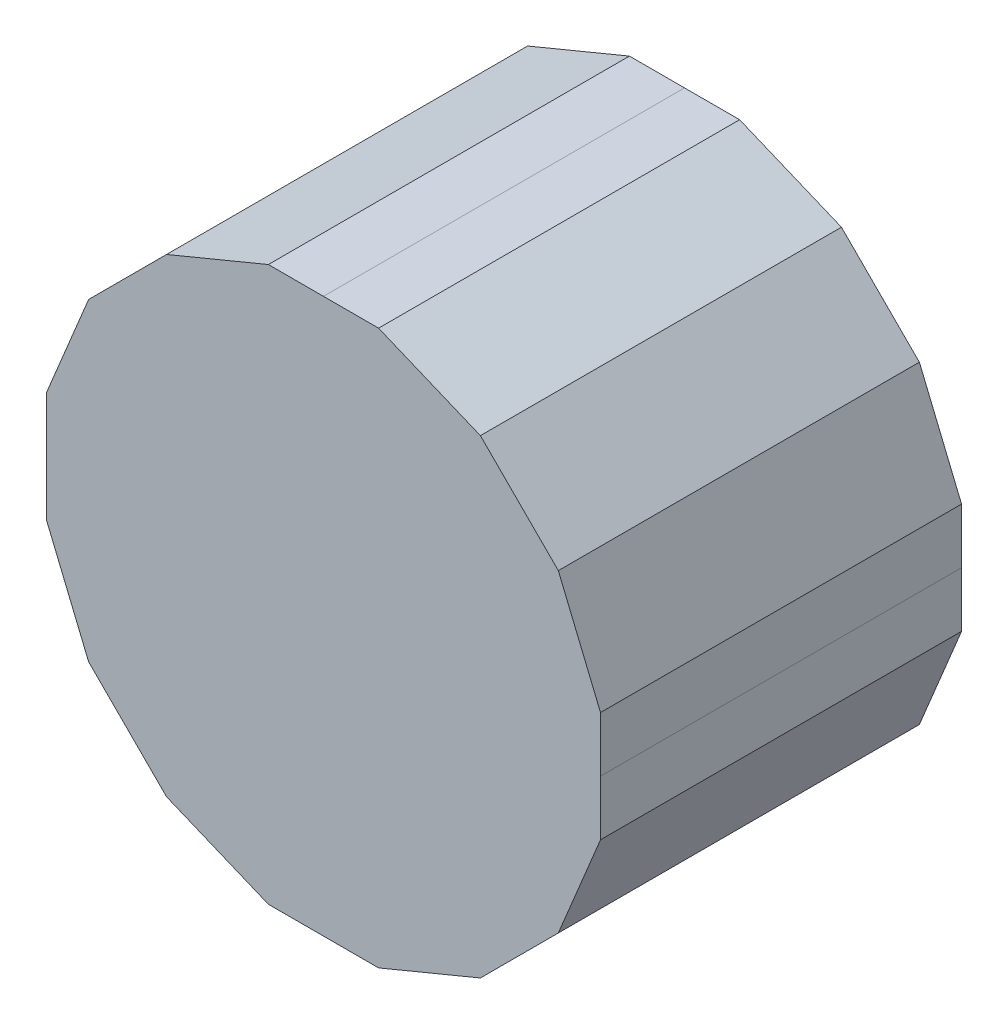
ISO-10303-21;
HEADER;
FILE_DESCRIPTION(('STEP AP214'),'2;1');
FILE_NAME('part.step','',(''),(''),'','','');
FILE_SCHEMA(('AUTOMOTIVE_DESIGN { 1 0 10303 214 1 1 1 1 }'));
ENDSEC;
DATA;
#1=APPLICATION_CONTEXT('core data for automotive mechanical design processes');
#2=APPLICATION_PROTOCOL_DEFINITION('international standard','automotive_design',2000,#1);
#3=PRODUCT_CONTEXT('',#1,'mechanical');
#4=PRODUCT('Part','Part','',(#3));
#5=PRODUCT_RELATED_PRODUCT_CATEGORY('part','',(#4));
#6=PRODUCT_DEFINITION_FORMATION('','',#4);
#7=PRODUCT_DEFINITION_CONTEXT('part definition',#1,'design');
#8=PRODUCT_DEFINITION('design','',#6,#7);
#9=PRODUCT_DEFINITION_SHAPE('','',#8);
#10=(LENGTH_UNIT() NAMED_UNIT(*) SI_UNIT(.MILLI.,.METRE.));
#11=(NAMED_UNIT(*) PLANE_ANGLE_UNIT() SI_UNIT($,.RADIAN.));
#12=(NAMED_UNIT(*) SI_UNIT($,.STERADIAN.) SOLID_ANGLE_UNIT());
#13=UNCERTAINTY_MEASURE_WITH_UNIT(LENGTH_MEASURE(1.E-05),#10,'distance_accuracy_value','');
#14=(GEOMETRIC_REPRESENTATION_CONTEXT(3) GLOBAL_UNCERTAINTY_ASSIGNED_CONTEXT((#13)) GLOBAL_UNIT_ASSIGNED_CONTEXT((#10,
#11,#12)) REPRESENTATION_CONTEXT('',''));
#15=CARTESIAN_POINT('',(0.,0.,0.));
#16=DIRECTION('',(0.,0.,1.));
#17=DIRECTION('',(1.,0.,0.));
#18=AXIS2_PLACEMENT_3D('',#15,#16,#17);
#19=CARTESIAN_POINT('',(-0.1994916,0.,0.25999948));
#20=DIRECTION('',(0.,0.,-1.));
#21=DIRECTION('',(0.,-1.,0.));
#22=AXIS2_PLACEMENT_3D('',#19,#20,#21);
#23=PLANE('',#22);
#24=DIRECTION('',(0.,-1.,0.));
#25=VECTOR('',#24,1.);
#26=CARTESIAN_POINT('',(-0.1994916,0.,0.25999948));
#27=LINE('',#26,#25);
#28=CARTESIAN_POINT('',(-0.1994916,0.,0.25999948));
#29=VERTEX_POINT('',#28);
#30=CARTESIAN_POINT('',(-0.1994916,-0.03968241999999,0.25999948));
#31=VERTEX_POINT('',#30);
#32=EDGE_CURVE('E210',#29,#31,#27,.T.);
#33=ORIENTED_EDGE('',*,*,#32,.T.);
#34=DIRECTION('',(0.382680621229843,-0.923880696916621,0.));
#35=VECTOR('',#34,1.);
#36=CARTESIAN_POINT('',(-0.1994916,-0.03968241999999,0.25999948));
#37=LINE('',#36,#35);
#38=CARTESIAN_POINT('',(-0.16912082,-0.1130046,0.25999948));
#39=VERTEX_POINT('',#38);
#40=EDGE_CURVE('E254',#31,#39,#37,.T.);
#41=ORIENTED_EDGE('',*,*,#40,.T.);
#42=DIRECTION('',(0.707106781186548,-0.707106781186548,0.));
#43=VECTOR('',#42,1.);
#44=CARTESIAN_POINT('',(-0.16912082,-0.1130046,0.25999948));
#45=LINE('',#44,#43);
#46=CARTESIAN_POINT('',(-0.1130046,-0.16912082,0.25999948));
#47=VERTEX_POINT('',#46);
#48=EDGE_CURVE('E261',#39,#47,#45,.T.);
#49=ORIENTED_EDGE('',*,*,#48,.T.);
#50=DIRECTION('',(0.923880696916975,-0.382680621228989,0.));
#51=VECTOR('',#50,1.);
#52=CARTESIAN_POINT('',(-0.1130046,-0.16912082,0.25999948));
#53=LINE('',#52,#51);
#54=CARTESIAN_POINT('',(-0.03968241999999,-0.1994916,0.25999948));
#55=VERTEX_POINT('',#54);
#56=EDGE_CURVE('E244',#47,#55,#53,.T.);
#57=ORIENTED_EDGE('',*,*,#56,.T.);
#58=DIRECTION('',(1.,0.,0.));
#59=VECTOR('',#58,1.);
#60=CARTESIAN_POINT('',(-0.03968241999999,-0.1994916,0.25999948));
#61=LINE('',#60,#59);
#62=CARTESIAN_POINT('',(0.,-0.1994916,0.25999948));
#63=VERTEX_POINT('',#62);
#64=EDGE_CURVE('E298',#55,#63,#61,.T.);
#65=ORIENTED_EDGE('',*,*,#64,.T.);
#66=DIRECTION('',(1.,0.,0.));
#67=VECTOR('',#66,1.);
#68=CARTESIAN_POINT('',(0.,-0.1994916,0.25999948));
#69=LINE('',#68,#67);
#70=CARTESIAN_POINT('',(0.03967987999999,-0.1994916,0.25999948));
#71=VERTEX_POINT('',#70);
#72=EDGE_CURVE('E317',#63,#71,#69,.T.);
#73=ORIENTED_EDGE('',*,*,#72,.T.);
#74=DIRECTION('',(0.923880696916621,0.382680621229843,0.));
#75=VECTOR('',#74,1.);
#76=CARTESIAN_POINT('',(0.03967987999999,-0.1994916,0.25999948));
#77=LINE('',#76,#75);
#78=CARTESIAN_POINT('',(0.11300206,-0.16912082,0.25999948));
#79=VERTEX_POINT('',#78);
#80=EDGE_CURVE('E329',#71,#79,#77,.T.);
#81=ORIENTED_EDGE('',*,*,#80,.T.);
#82=DIRECTION('',(0.707106781186548,0.707106781186548,0.));
#83=VECTOR('',#82,1.);
#84=CARTESIAN_POINT('',(0.11300206,-0.16912082,0.25999948));
#85=LINE('',#84,#83);
#86=CARTESIAN_POINT('',(0.16911828,-0.1130046,0.25999948));
#87=VERTEX_POINT('',#86);
#88=EDGE_CURVE('E358',#79,#87,#85,.T.);
#89=ORIENTED_EDGE('',*,*,#88,.T.);
#90=DIRECTION('',(0.382707938546856,0.923869381337652,0.));
#91=VECTOR('',#90,1.);
#92=CARTESIAN_POINT('',(0.16911828,-0.1130046,0.25999948));
#93=LINE('',#92,#91);
#94=CARTESIAN_POINT('',(0.1994916,-0.03968241999999,0.25999948));
#95=VERTEX_POINT('',#94);
#96=EDGE_CURVE('E265',#87,#95,#93,.T.);
#97=ORIENTED_EDGE('',*,*,#96,.T.);
#98=DIRECTION('',(0.,1.,0.));
#99=VECTOR('',#98,1.);
#100=CARTESIAN_POINT('',(0.1994916,-0.03968241999999,0.25999948));
#101=LINE('',#100,#99);
#102=CARTESIAN_POINT('',(0.1994916,0.,0.25999948));
#103=VERTEX_POINT('',#102);
#104=EDGE_CURVE('E237',#95,#103,#101,.T.);
#105=ORIENTED_EDGE('',*,*,#104,.T.);
#106=DIRECTION('',(0.,1.,0.));
#107=VECTOR('',#106,1.);
#108=CARTESIAN_POINT('',(0.1994916,0.,0.25999948));
#109=LINE('',#108,#107);
#110=CARTESIAN_POINT('',(0.1994916,0.03967988000002,0.25999948));
#111=VERTEX_POINT('',#110);
#112=EDGE_CURVE('E379',#103,#111,#109,.T.);
#113=ORIENTED_EDGE('',*,*,#112,.T.);
#114=DIRECTION('',(-0.382707938546856,0.923869381337652,0.));
#115=VECTOR('',#114,1.);
#116=CARTESIAN_POINT('',(0.1994916,0.03967988000002,0.25999948));
#117=LINE('',#116,#115);
#118=CARTESIAN_POINT('',(0.16911828,0.11300206,0.25999948));
#119=VERTEX_POINT('',#118);
#120=EDGE_CURVE('E281',#111,#119,#117,.T.);
#121=ORIENTED_EDGE('',*,*,#120,.T.);
#122=DIRECTION('',(-0.707106781186548,0.707106781186548,0.));
#123=VECTOR('',#122,1.);
#124=CARTESIAN_POINT('',(0.16911828,0.11300206,0.25999948));
#125=LINE('',#124,#123);
#126=CARTESIAN_POINT('',(0.11300206,0.16911828,0.25999948));
#127=VERTEX_POINT('',#126);
#128=EDGE_CURVE('E232',#119,#127,#125,.T.);
#129=ORIENTED_EDGE('',*,*,#128,.T.);
#130=DIRECTION('',(-0.923869381337652,0.382707938546856,0.));
#131=VECTOR('',#130,1.);
#132=CARTESIAN_POINT('',(0.11300206,0.16911828,0.25999948));
#133=LINE('',#132,#131);
#134=CARTESIAN_POINT('',(0.03967987999999,0.1994916,0.25999948));
#135=VERTEX_POINT('',#134);
#136=EDGE_CURVE('E335',#127,#135,#133,.T.);
#137=ORIENTED_EDGE('',*,*,#136,.T.);
#138=DIRECTION('',(-1.,0.,0.));
#139=VECTOR('',#138,1.);
#140=CARTESIAN_POINT('',(0.03967987999999,0.1994916,0.25999948));
#141=LINE('',#140,#139);
#142=CARTESIAN_POINT('',(0.,0.1994916,0.25999948));
#143=VERTEX_POINT('',#142);
#144=EDGE_CURVE('E409',#135,#143,#141,.T.);
#145=ORIENTED_EDGE('',*,*,#144,.T.);
#146=DIRECTION('',(-1.,0.,0.));
#147=VECTOR('',#146,1.);
#148=CARTESIAN_POINT('',(0.,0.1994916,0.25999948));
#149=LINE('',#148,#147);
#150=CARTESIAN_POINT('',(-0.03968241999999,0.1994916,0.25999948));
#151=VERTEX_POINT('',#150);
#152=EDGE_CURVE('E404',#143,#151,#149,.T.);
#153=ORIENTED_EDGE('',*,*,#152,.T.);
#154=DIRECTION('',(-0.923869381337652,-0.382707938546856,0.));
#155=VECTOR('',#154,1.);
#156=CARTESIAN_POINT('',(-0.03968241999999,0.1994916,0.25999948));
#157=LINE('',#156,#155);
#158=CARTESIAN_POINT('',(-0.1130046,0.16911828,0.25999948));
#159=VERTEX_POINT('',#158);
#160=EDGE_CURVE('E274',#151,#159,#157,.T.);
#161=ORIENTED_EDGE('',*,*,#160,.T.);
#162=DIRECTION('',(-0.707106781186548,-0.707106781186548,0.));
#163=VECTOR('',#162,1.);
#164=CARTESIAN_POINT('',(-0.1130046,0.16911828,0.25999948));
#165=LINE('',#164,#163);
#166=CARTESIAN_POINT('',(-0.16912082,0.11300206,0.25999948));
#167=VERTEX_POINT('',#166);
#168=EDGE_CURVE('E342',#159,#167,#165,.T.);
#169=ORIENTED_EDGE('',*,*,#168,.T.);
#170=DIRECTION('',(-0.382680621229843,-0.923880696916621,0.));
#171=VECTOR('',#170,1.);
#172=CARTESIAN_POINT('',(-0.16912082,0.11300206,0.25999948));
#173=LINE('',#172,#171);
#174=CARTESIAN_POINT('',(-0.1994916,0.03967988000002,0.25999948));
#175=VERTEX_POINT('',#174);
#176=EDGE_CURVE('E202',#167,#175,#173,.T.);
#177=ORIENTED_EDGE('',*,*,#176,.T.);
#178=DIRECTION('',(0.,-1.,0.));
#179=VECTOR('',#178,1.);
#180=CARTESIAN_POINT('',(-0.1994916,0.03967988000002,0.25999948));
#181=LINE('',#180,#179);
#182=EDGE_CURVE('E11',#175,#29,#181,.T.);
#183=ORIENTED_EDGE('',*,*,#182,.T.);
#184=EDGE_LOOP('',(#33,#41,#49,#57,#65,#73,#81,#89,#97,#105,#113,#121,#129,#137,#145,#153,#161,
#169,#177,#183));
#185=FACE_BOUND('',#184,.T.);
#186=ADVANCED_FACE('F17',(#185),#23,.F.);
#187=CARTESIAN_POINT('',(-0.1994916,0.,0.));
#188=DIRECTION('',(0.,0.,-1.));
#189=DIRECTION('',(0.,-1.,0.));
#190=AXIS2_PLACEMENT_3D('',#187,#188,#189);
#191=PLANE('',#190);
#192=DIRECTION('',(0.,-1.,0.));
#193=VECTOR('',#192,1.);
#194=CARTESIAN_POINT('',(-0.1994916,0.03967988000002,0.));
#195=LINE('',#194,#193);
#196=CARTESIAN_POINT('',(-0.1994916,0.03967988000002,0.));
#197=VERTEX_POINT('',#196);
#198=CARTESIAN_POINT('',(-0.1994916,0.,0.));
#199=VERTEX_POINT('',#198);
#200=EDGE_CURVE('E25',#197,#199,#195,.T.);
#201=ORIENTED_EDGE('',*,*,#200,.F.);
#202=DIRECTION('',(-0.382680621229843,-0.923880696916621,0.));
#203=VECTOR('',#202,1.);
#204=CARTESIAN_POINT('',(-0.16912082,0.11300206,0.));
#205=LINE('',#204,#203);
#206=CARTESIAN_POINT('',(-0.16912082,0.11300206,0.));
#207=VERTEX_POINT('',#206);
#208=EDGE_CURVE('E346',#207,#197,#205,.T.);
#209=ORIENTED_EDGE('',*,*,#208,.F.);
#210=DIRECTION('',(-0.707106781186548,-0.707106781186548,0.));
#211=VECTOR('',#210,1.);
#212=CARTESIAN_POINT('',(-0.1130046,0.16911828,0.));
#213=LINE('',#212,#211);
#214=CARTESIAN_POINT('',(-0.1130046,0.16911828,0.));
#215=VERTEX_POINT('',#214);
#216=EDGE_CURVE('E269',#215,#207,#213,.T.);
#217=ORIENTED_EDGE('',*,*,#216,.F.);
#218=DIRECTION('',(-0.923869381337652,-0.382707938546856,0.));
#219=VECTOR('',#218,1.);
#220=CARTESIAN_POINT('',(-0.03968241999999,0.1994916,0.));
#221=LINE('',#220,#219);
#222=CARTESIAN_POINT('',(-0.03968241999999,0.1994916,0.));
#223=VERTEX_POINT('',#222);
#224=EDGE_CURVE('E422',#223,#215,#221,.T.);
#225=ORIENTED_EDGE('',*,*,#224,.F.);
#226=DIRECTION('',(-1.,0.,0.));
#227=VECTOR('',#226,1.);
#228=CARTESIAN_POINT('',(0.,0.1994916,0.));
#229=LINE('',#228,#227);
#230=CARTESIAN_POINT('',(0.,0.1994916,0.));
#231=VERTEX_POINT('',#230);
#232=EDGE_CURVE('E405',#231,#223,#229,.T.);
#233=ORIENTED_EDGE('',*,*,#232,.F.);
#234=DIRECTION('',(-1.,0.,0.));
#235=VECTOR('',#234,1.);
#236=CARTESIAN_POINT('',(0.03967987999999,0.1994916,0.));
#237=LINE('',#236,#235);
#238=CARTESIAN_POINT('',(0.03967987999999,0.1994916,0.));
#239=VERTEX_POINT('',#238);
#240=EDGE_CURVE('E330',#239,#231,#237,.T.);
#241=ORIENTED_EDGE('',*,*,#240,.F.);
#242=DIRECTION('',(-0.923869381337652,0.382707938546856,0.));
#243=VECTOR('',#242,1.);
#244=CARTESIAN_POINT('',(0.11300206,0.16911828,0.));
#245=LINE('',#244,#243);
#246=CARTESIAN_POINT('',(0.11300206,0.16911828,0.));
#247=VERTEX_POINT('',#246);
#248=EDGE_CURVE('E309',#247,#239,#245,.T.);
#249=ORIENTED_EDGE('',*,*,#248,.F.);
#250=DIRECTION('',(-0.707106781186548,0.707106781186548,0.));
#251=VECTOR('',#250,1.);
#252=CARTESIAN_POINT('',(0.16911828,0.11300206,0.));
#253=LINE('',#252,#251);
#254=CARTESIAN_POINT('',(0.16911828,0.11300206,0.));
#255=VERTEX_POINT('',#254);
#256=EDGE_CURVE('E233',#255,#247,#253,.T.);
#257=ORIENTED_EDGE('',*,*,#256,.F.);
#258=DIRECTION('',(-0.382707938546856,0.923869381337652,0.));
#259=VECTOR('',#258,1.);
#260=CARTESIAN_POINT('',(0.1994916,0.03967988000002,0.));
#261=LINE('',#260,#259);
#262=CARTESIAN_POINT('',(0.1994916,0.03967988000002,0.));
#263=VERTEX_POINT('',#262);
#264=EDGE_CURVE('E383',#263,#255,#261,.T.);
#265=ORIENTED_EDGE('',*,*,#264,.F.);
#266=DIRECTION('',(0.,1.,0.));
#267=VECTOR('',#266,1.);
#268=CARTESIAN_POINT('',(0.1994916,0.,0.));
#269=LINE('',#268,#267);
#270=CARTESIAN_POINT('',(0.1994916,0.,0.));
#271=VERTEX_POINT('',#270);
#272=EDGE_CURVE('E285',#271,#263,#269,.T.);
#273=ORIENTED_EDGE('',*,*,#272,.F.);
#274=DIRECTION('',(0.,1.,0.));
#275=VECTOR('',#274,1.);
#276=CARTESIAN_POINT('',(0.1994916,-0.03968241999999,0.));
#277=LINE('',#276,#275);
#278=CARTESIAN_POINT('',(0.1994916,-0.03968241999999,0.));
#279=VERTEX_POINT('',#278);
#280=EDGE_CURVE('E238',#279,#271,#277,.T.);
#281=ORIENTED_EDGE('',*,*,#280,.F.);
#282=DIRECTION('',(0.382707938546856,0.923869381337652,0.));
#283=VECTOR('',#282,1.);
#284=CARTESIAN_POINT('',(0.16911828,-0.1130046,0.));
#285=LINE('',#284,#283);
#286=CARTESIAN_POINT('',(0.16911828,-0.1130046,0.));
#287=VERTEX_POINT('',#286);
#288=EDGE_CURVE('E362',#287,#279,#285,.T.);
#289=ORIENTED_EDGE('',*,*,#288,.F.);
#290=DIRECTION('',(0.707106781186548,0.707106781186548,0.));
#291=VECTOR('',#290,1.);
#292=CARTESIAN_POINT('',(0.11300206,-0.16912082,0.));
#293=LINE('',#292,#291);
#294=CARTESIAN_POINT('',(0.11300206,-0.16912082,0.));
#295=VERTEX_POINT('',#294);
#296=EDGE_CURVE('E339',#295,#287,#293,.T.);
#297=ORIENTED_EDGE('',*,*,#296,.F.);
#298=DIRECTION('',(0.923880696916621,0.382680621229843,0.));
#299=VECTOR('',#298,1.);
#300=CARTESIAN_POINT('',(0.03967987999999,-0.1994916,0.));
#301=LINE('',#300,#299);
#302=CARTESIAN_POINT('',(0.03967987999999,-0.1994916,0.));
#303=VERTEX_POINT('',#302);
#304=EDGE_CURVE('E321',#303,#295,#301,.T.);
#305=ORIENTED_EDGE('',*,*,#304,.F.);
#306=DIRECTION('',(1.,0.,0.));
#307=VECTOR('',#306,1.);
#308=CARTESIAN_POINT('',(0.,-0.1994916,0.));
#309=LINE('',#308,#307);
#310=CARTESIAN_POINT('',(0.,-0.1994916,0.));
#311=VERTEX_POINT('',#310);
#312=EDGE_CURVE('E305',#311,#303,#309,.T.);
#313=ORIENTED_EDGE('',*,*,#312,.F.);
#314=DIRECTION('',(1.,0.,0.));
#315=VECTOR('',#314,1.);
#316=CARTESIAN_POINT('',(-0.03968241999999,-0.1994916,0.));
#317=LINE('',#316,#315);
#318=CARTESIAN_POINT('',(-0.03968241999999,-0.1994916,0.));
#319=VERTEX_POINT('',#318);
#320=EDGE_CURVE('E293',#319,#311,#317,.T.);
#321=ORIENTED_EDGE('',*,*,#320,.F.);
#322=DIRECTION('',(0.923880696916975,-0.382680621228989,0.));
#323=VECTOR('',#322,1.);
#324=CARTESIAN_POINT('',(-0.1130046,-0.16912082,0.));
#325=LINE('',#324,#323);
#326=CARTESIAN_POINT('',(-0.1130046,-0.16912082,0.));
#327=VERTEX_POINT('',#326);
#328=EDGE_CURVE('E245',#327,#319,#325,.T.);
#329=ORIENTED_EDGE('',*,*,#328,.F.);
#330=DIRECTION('',(0.707106781186548,-0.707106781186548,0.));
#331=VECTOR('',#330,1.);
#332=CARTESIAN_POINT('',(-0.16912082,-0.1130046,0.));
#333=LINE('',#332,#331);
#334=CARTESIAN_POINT('',(-0.16912082,-0.1130046,0.));
#335=VERTEX_POINT('',#334);
#336=EDGE_CURVE('E249',#335,#327,#333,.T.);
#337=ORIENTED_EDGE('',*,*,#336,.F.);
#338=DIRECTION('',(0.382680621229843,-0.923880696916621,0.));
#339=VECTOR('',#338,1.);
#340=CARTESIAN_POINT('',(-0.1994916,-0.03968241999999,0.));
#341=LINE('',#340,#339);
#342=CARTESIAN_POINT('',(-0.1994916,-0.03968241999999,0.));
#343=VERTEX_POINT('',#342);
#344=EDGE_CURVE('E212',#343,#335,#341,.T.);
#345=ORIENTED_EDGE('',*,*,#344,.F.);
#346=DIRECTION('',(0.,-1.,0.));
#347=VECTOR('',#346,1.);
#348=CARTESIAN_POINT('',(-0.1994916,0.,0.));
#349=LINE('',#348,#347);
#350=EDGE_CURVE('E208',#199,#343,#349,.T.);
#351=ORIENTED_EDGE('',*,*,#350,.F.);
#352=EDGE_LOOP('',(#201,#209,#217,#225,#233,#241,#249,#257,#265,#273,#281,#289,#297,#305,#313,
#321,#329,#337,#345,#351));
#353=FACE_BOUND('',#352,.T.);
#354=ADVANCED_FACE('F214',(#353),#191,.T.);
#355=CARTESIAN_POINT('',(-0.1994916,0.03967988000002,0.));
#356=DIRECTION('',(1.,0.,0.));
#357=DIRECTION('',(0.,1.,0.));
#358=AXIS2_PLACEMENT_3D('',#355,#356,#357);
#359=PLANE('',#358);
#360=ORIENTED_EDGE('',*,*,#200,.T.);
#361=DIRECTION('',(0.,0.,1.));
#362=VECTOR('',#361,1.);
#363=CARTESIAN_POINT('',(-0.1994916,0.,0.));
#364=LINE('',#363,#362);
#365=EDGE_CURVE('E196',#199,#29,#364,.T.);
#366=ORIENTED_EDGE('',*,*,#365,.T.);
#367=ORIENTED_EDGE('',*,*,#182,.F.);
#368=DIRECTION('',(0.,0.,1.));
#369=VECTOR('',#368,1.);
#370=CARTESIAN_POINT('',(-0.1994916,0.03967988000002,0.));
#371=LINE('',#370,#369);
#372=EDGE_CURVE('E199',#197,#175,#371,.T.);
#373=ORIENTED_EDGE('',*,*,#372,.F.);
#374=EDGE_LOOP('',(#360,#366,#367,#373));
#375=FACE_BOUND('',#374,.T.);
#376=ADVANCED_FACE('F195',(#375),#359,.F.);
#377=CARTESIAN_POINT('',(-0.16912082,0.11300206,0.));
#378=DIRECTION('',(0.923880696916621,-0.382680621229843,0.));
#379=DIRECTION('',(0.,0.,-1.));
#380=AXIS2_PLACEMENT_3D('',#377,#378,#379);
#381=PLANE('',#380);
#382=ORIENTED_EDGE('',*,*,#208,.T.);
#383=ORIENTED_EDGE('',*,*,#372,.T.);
#384=ORIENTED_EDGE('',*,*,#176,.F.);
#385=DIRECTION('',(0.,0.,1.));
#386=VECTOR('',#385,1.);
#387=CARTESIAN_POINT('',(-0.16912082,0.11300206,0.));
#388=LINE('',#387,#386);
#389=EDGE_CURVE('E273',#207,#167,#388,.T.);
#390=ORIENTED_EDGE('',*,*,#389,.F.);
#391=EDGE_LOOP('',(#382,#383,#384,#390));
#392=FACE_BOUND('',#391,.T.);
#393=ADVANCED_FACE('F438',(#392),#381,.F.);
#394=CARTESIAN_POINT('',(-0.1130046,0.16911828,0.));
#395=DIRECTION('',(0.707106781186548,-0.707106781186548,0.));
#396=DIRECTION('',(0.,0.,-1.));
#397=AXIS2_PLACEMENT_3D('',#394,#395,#396);
#398=PLANE('',#397);
#399=ORIENTED_EDGE('',*,*,#216,.T.);
#400=ORIENTED_EDGE('',*,*,#389,.T.);
#401=ORIENTED_EDGE('',*,*,#168,.F.);
#402=DIRECTION('',(0.,0.,1.));
#403=VECTOR('',#402,1.);
#404=CARTESIAN_POINT('',(-0.1130046,0.16911828,0.));
#405=LINE('',#404,#403);
#406=EDGE_CURVE('E428',#215,#159,#405,.T.);
#407=ORIENTED_EDGE('',*,*,#406,.F.);
#408=EDGE_LOOP('',(#399,#400,#401,#407));
#409=FACE_BOUND('',#408,.T.);
#410=ADVANCED_FACE('F443',(#409),#398,.F.);
#411=CARTESIAN_POINT('',(-0.03968241999999,0.1994916,0.));
#412=DIRECTION('',(0.382707938546856,-0.923869381337652,0.));
#413=DIRECTION('',(0.,0.,-1.));
#414=AXIS2_PLACEMENT_3D('',#411,#412,#413);
#415=PLANE('',#414);
#416=ORIENTED_EDGE('',*,*,#224,.T.);
#417=ORIENTED_EDGE('',*,*,#406,.T.);
#418=ORIENTED_EDGE('',*,*,#160,.F.);
#419=DIRECTION('',(0.,0.,1.));
#420=VECTOR('',#419,1.);
#421=CARTESIAN_POINT('',(-0.03968241999999,0.1994916,0.));
#422=LINE('',#421,#420);
#423=EDGE_CURVE('E400',#223,#151,#422,.T.);
#424=ORIENTED_EDGE('',*,*,#423,.F.);
#425=EDGE_LOOP('',(#416,#417,#418,#424));
#426=FACE_BOUND('',#425,.T.);
#427=ADVANCED_FACE('F445',(#426),#415,.F.);
#428=CARTESIAN_POINT('',(0.,0.1994916,0.));
#429=DIRECTION('',(0.,-1.,0.));
#430=DIRECTION('',(0.,0.,-1.));
#431=AXIS2_PLACEMENT_3D('',#428,#429,#430);
#432=PLANE('',#431);
#433=ORIENTED_EDGE('',*,*,#232,.T.);
#434=ORIENTED_EDGE('',*,*,#423,.T.);
#435=ORIENTED_EDGE('',*,*,#152,.F.);
#436=DIRECTION('',(0.,0.,1.));
#437=VECTOR('',#436,1.);
#438=CARTESIAN_POINT('',(0.,0.1994916,0.));
#439=LINE('',#438,#437);
#440=EDGE_CURVE('E334',#231,#143,#439,.T.);
#441=ORIENTED_EDGE('',*,*,#440,.F.);
#442=EDGE_LOOP('',(#433,#434,#435,#441));
#443=FACE_BOUND('',#442,.T.);
#444=ADVANCED_FACE('F448',(#443),#432,.F.);
#445=CARTESIAN_POINT('',(0.03967987999999,0.1994916,0.));
#446=DIRECTION('',(0.,-1.,0.));
#447=DIRECTION('',(0.,0.,-1.));
#448=AXIS2_PLACEMENT_3D('',#445,#446,#447);
#449=PLANE('',#448);
#450=ORIENTED_EDGE('',*,*,#240,.T.);
#451=ORIENTED_EDGE('',*,*,#440,.T.);
#452=ORIENTED_EDGE('',*,*,#144,.F.);
#453=DIRECTION('',(0.,0.,1.));
#454=VECTOR('',#453,1.);
#455=CARTESIAN_POINT('',(0.03967987999999,0.1994916,0.));
#456=LINE('',#455,#454);
#457=EDGE_CURVE('E351',#239,#135,#456,.T.);
#458=ORIENTED_EDGE('',*,*,#457,.F.);
#459=EDGE_LOOP('',(#450,#451,#452,#458));
#460=FACE_BOUND('',#459,.T.);
#461=ADVANCED_FACE('F452',(#460),#449,.F.);
#462=CARTESIAN_POINT('',(0.11300206,0.16911828,0.));
#463=DIRECTION('',(-0.382707938546856,-0.923869381337652,0.));
#464=DIRECTION('',(-0.923869381337652,0.382707938546856,0.));
#465=AXIS2_PLACEMENT_3D('',#462,#463,#464);
#466=PLANE('',#465);
#467=ORIENTED_EDGE('',*,*,#248,.T.);
#468=ORIENTED_EDGE('',*,*,#457,.T.);
#469=ORIENTED_EDGE('',*,*,#136,.F.);
#470=DIRECTION('',(0.,0.,1.));
#471=VECTOR('',#470,1.);
#472=CARTESIAN_POINT('',(0.11300206,0.16911828,0.));
#473=LINE('',#472,#471);
#474=EDGE_CURVE('E228',#247,#127,#473,.T.);
#475=ORIENTED_EDGE('',*,*,#474,.F.);
#476=EDGE_LOOP('',(#467,#468,#469,#475));
#477=FACE_BOUND('',#476,.T.);
#478=ADVANCED_FACE('F454',(#477),#466,.F.);
#479=CARTESIAN_POINT('',(0.16911828,0.11300206,0.));
#480=DIRECTION('',(-0.707106781186548,-0.707106781186548,0.));
#481=DIRECTION('',(-0.707106781186548,0.707106781186548,0.));
#482=AXIS2_PLACEMENT_3D('',#479,#480,#481);
#483=PLANE('',#482);
#484=ORIENTED_EDGE('',*,*,#256,.T.);
#485=ORIENTED_EDGE('',*,*,#474,.T.);
#486=ORIENTED_EDGE('',*,*,#128,.F.);
#487=DIRECTION('',(0.,0.,1.));
#488=VECTOR('',#487,1.);
#489=CARTESIAN_POINT('',(0.16911828,0.11300206,0.));
#490=LINE('',#489,#488);
#491=EDGE_CURVE('E387',#255,#119,#490,.T.);
#492=ORIENTED_EDGE('',*,*,#491,.F.);
#493=EDGE_LOOP('',(#484,#485,#486,#492));
#494=FACE_BOUND('',#493,.T.);
#495=ADVANCED_FACE('F457',(#494),#483,.F.);
#496=CARTESIAN_POINT('',(0.1994916,0.03967988000002,0.));
#497=DIRECTION('',(-0.923869381337652,-0.382707938546856,0.));
#498=DIRECTION('',(-0.382707938546856,0.923869381337652,0.));
#499=AXIS2_PLACEMENT_3D('',#496,#497,#498);
#500=PLANE('',#499);
#501=ORIENTED_EDGE('',*,*,#264,.T.);
#502=ORIENTED_EDGE('',*,*,#491,.T.);
#503=ORIENTED_EDGE('',*,*,#120,.F.);
#504=DIRECTION('',(0.,0.,1.));
#505=VECTOR('',#504,1.);
#506=CARTESIAN_POINT('',(0.1994916,0.03967988000002,0.));
#507=LINE('',#506,#505);
#508=EDGE_CURVE('E289',#263,#111,#507,.T.);
#509=ORIENTED_EDGE('',*,*,#508,.F.);
#510=EDGE_LOOP('',(#501,#502,#503,#509));
#511=FACE_BOUND('',#510,.T.);
#512=ADVANCED_FACE('F461',(#511),#500,.F.);
#513=CARTESIAN_POINT('',(0.1994916,0.,0.));
#514=DIRECTION('',(-1.,0.,0.));
#515=DIRECTION('',(0.,0.,1.));
#516=AXIS2_PLACEMENT_3D('',#513,#514,#515);
#517=PLANE('',#516);
#518=ORIENTED_EDGE('',*,*,#272,.T.);
#519=ORIENTED_EDGE('',*,*,#508,.T.);
#520=ORIENTED_EDGE('',*,*,#112,.F.);
#521=DIRECTION('',(0.,0.,1.));
#522=VECTOR('',#521,1.);
#523=CARTESIAN_POINT('',(0.1994916,0.,0.));
#524=LINE('',#523,#522);
#525=EDGE_CURVE('E234',#271,#103,#524,.T.);
#526=ORIENTED_EDGE('',*,*,#525,.F.);
#527=EDGE_LOOP('',(#518,#519,#520,#526));
#528=FACE_BOUND('',#527,.T.);
#529=ADVANCED_FACE('F463',(#528),#517,.F.);
#530=CARTESIAN_POINT('',(0.1994916,-0.03968241999999,0.));
#531=DIRECTION('',(-1.,0.,0.));
#532=DIRECTION('',(0.,0.,1.));
#533=AXIS2_PLACEMENT_3D('',#530,#531,#532);
#534=PLANE('',#533);
#535=ORIENTED_EDGE('',*,*,#280,.T.);
#536=ORIENTED_EDGE('',*,*,#525,.T.);
#537=ORIENTED_EDGE('',*,*,#104,.F.);
#538=DIRECTION('',(0.,0.,1.));
#539=VECTOR('',#538,1.);
#540=CARTESIAN_POINT('',(0.1994916,-0.03968241999999,0.));
#541=LINE('',#540,#539);
#542=EDGE_CURVE('E366',#279,#95,#541,.T.);
#543=ORIENTED_EDGE('',*,*,#542,.F.);
#544=EDGE_LOOP('',(#535,#536,#537,#543));
#545=FACE_BOUND('',#544,.T.);
#546=ADVANCED_FACE('F466',(#545),#534,.F.);
#547=CARTESIAN_POINT('',(0.16911828,-0.1130046,0.));
#548=DIRECTION('',(-0.923869381337652,0.382707938546856,0.));
#549=DIRECTION('',(0.,0.,1.));
#550=AXIS2_PLACEMENT_3D('',#547,#548,#549);
#551=PLANE('',#550);
#552=ORIENTED_EDGE('',*,*,#288,.T.);
#553=ORIENTED_EDGE('',*,*,#542,.T.);
#554=ORIENTED_EDGE('',*,*,#96,.F.);
#555=DIRECTION('',(0.,0.,1.));
#556=VECTOR('',#555,1.);
#557=CARTESIAN_POINT('',(0.16911828,-0.1130046,0.));
#558=LINE('',#557,#556);
#559=EDGE_CURVE('E350',#287,#87,#558,.T.);
#560=ORIENTED_EDGE('',*,*,#559,.F.);
#561=EDGE_LOOP('',(#552,#553,#554,#560));
#562=FACE_BOUND('',#561,.T.);
#563=ADVANCED_FACE('F470',(#562),#551,.F.);
#564=CARTESIAN_POINT('',(0.11300206,-0.16912082,0.));
#565=DIRECTION('',(-0.707106781186548,0.707106781186548,0.));
#566=DIRECTION('',(0.,0.,1.));
#567=AXIS2_PLACEMENT_3D('',#564,#565,#566);
#568=PLANE('',#567);
#569=ORIENTED_EDGE('',*,*,#296,.T.);
#570=ORIENTED_EDGE('',*,*,#559,.T.);
#571=ORIENTED_EDGE('',*,*,#88,.F.);
#572=DIRECTION('',(0.,0.,1.));
#573=VECTOR('',#572,1.);
#574=CARTESIAN_POINT('',(0.11300206,-0.16912082,0.));
#575=LINE('',#574,#573);
#576=EDGE_CURVE('E325',#295,#79,#575,.T.);
#577=ORIENTED_EDGE('',*,*,#576,.F.);
#578=EDGE_LOOP('',(#569,#570,#571,#577));
#579=FACE_BOUND('',#578,.T.);
#580=ADVANCED_FACE('F472',(#579),#568,.F.);
#581=CARTESIAN_POINT('',(0.03967987999999,-0.1994916,0.));
#582=DIRECTION('',(-0.382680621229843,0.923880696916621,0.));
#583=DIRECTION('',(0.,0.,1.));
#584=AXIS2_PLACEMENT_3D('',#581,#582,#583);
#585=PLANE('',#584);
#586=ORIENTED_EDGE('',*,*,#304,.T.);
#587=ORIENTED_EDGE('',*,*,#576,.T.);
#588=ORIENTED_EDGE('',*,*,#80,.F.);
#589=DIRECTION('',(0.,0.,1.));
#590=VECTOR('',#589,1.);
#591=CARTESIAN_POINT('',(0.03967987999999,-0.1994916,0.));
#592=LINE('',#591,#590);
#593=EDGE_CURVE('E313',#303,#71,#592,.T.);
#594=ORIENTED_EDGE('',*,*,#593,.F.);
#595=EDGE_LOOP('',(#586,#587,#588,#594));
#596=FACE_BOUND('',#595,.T.);
#597=ADVANCED_FACE('F475',(#596),#585,.F.);
#598=CARTESIAN_POINT('',(0.,-0.1994916,0.));
#599=DIRECTION('',(0.,1.,0.));
#600=DIRECTION('',(1.,0.,0.));
#601=AXIS2_PLACEMENT_3D('',#598,#599,#600);
#602=PLANE('',#601);
#603=ORIENTED_EDGE('',*,*,#312,.T.);
#604=ORIENTED_EDGE('',*,*,#593,.T.);
#605=ORIENTED_EDGE('',*,*,#72,.F.);
#606=DIRECTION('',(0.,0.,1.));
#607=VECTOR('',#606,1.);
#608=CARTESIAN_POINT('',(0.,-0.1994916,0.));
#609=LINE('',#608,#607);
#610=EDGE_CURVE('E294',#311,#63,#609,.T.);
#611=ORIENTED_EDGE('',*,*,#610,.F.);
#612=EDGE_LOOP('',(#603,#604,#605,#611));
#613=FACE_BOUND('',#612,.T.);
#614=ADVANCED_FACE('F479',(#613),#602,.F.);
#615=CARTESIAN_POINT('',(-0.03968241999999,-0.1994916,0.));
#616=DIRECTION('',(0.,1.,0.));
#617=DIRECTION('',(1.,0.,0.));
#618=AXIS2_PLACEMENT_3D('',#615,#616,#617);
#619=PLANE('',#618);
#620=ORIENTED_EDGE('',*,*,#320,.T.);
#621=ORIENTED_EDGE('',*,*,#610,.T.);
#622=ORIENTED_EDGE('',*,*,#64,.F.);
#623=DIRECTION('',(0.,0.,1.));
#624=VECTOR('',#623,1.);
#625=CARTESIAN_POINT('',(-0.03968241999999,-0.1994916,0.));
#626=LINE('',#625,#624);
#627=EDGE_CURVE('E240',#319,#55,#626,.T.);
#628=ORIENTED_EDGE('',*,*,#627,.F.);
#629=EDGE_LOOP('',(#620,#621,#622,#628));
#630=FACE_BOUND('',#629,.T.);
#631=ADVANCED_FACE('F481',(#630),#619,.F.);
#632=CARTESIAN_POINT('',(-0.1130046,-0.16912082,0.));
#633=DIRECTION('',(0.382680621228989,0.923880696916975,0.));
#634=DIRECTION('',(0.,0.,-1.));
#635=AXIS2_PLACEMENT_3D('',#632,#633,#634);
#636=PLANE('',#635);
#637=ORIENTED_EDGE('',*,*,#328,.T.);
#638=ORIENTED_EDGE('',*,*,#627,.T.);
#639=ORIENTED_EDGE('',*,*,#56,.F.);
#640=DIRECTION('',(0.,0.,1.));
#641=VECTOR('',#640,1.);
#642=CARTESIAN_POINT('',(-0.1130046,-0.16912082,0.));
#643=LINE('',#642,#641);
#644=EDGE_CURVE('E253',#327,#47,#643,.T.);
#645=ORIENTED_EDGE('',*,*,#644,.F.);
#646=EDGE_LOOP('',(#637,#638,#639,#645));
#647=FACE_BOUND('',#646,.T.);
#648=ADVANCED_FACE('F484',(#647),#636,.F.);
#649=CARTESIAN_POINT('',(-0.16912082,-0.1130046,0.));
#650=DIRECTION('',(0.707106781186548,0.707106781186548,0.));
#651=DIRECTION('',(0.,0.,-1.));
#652=AXIS2_PLACEMENT_3D('',#649,#650,#651);
#653=PLANE('',#652);
#654=ORIENTED_EDGE('',*,*,#336,.T.);
#655=ORIENTED_EDGE('',*,*,#644,.T.);
#656=ORIENTED_EDGE('',*,*,#48,.F.);
#657=DIRECTION('',(0.,0.,1.));
#658=VECTOR('',#657,1.);
#659=CARTESIAN_POINT('',(-0.16912082,-0.1130046,0.));
#660=LINE('',#659,#658);
#661=EDGE_CURVE('E248',#335,#39,#660,.T.);
#662=ORIENTED_EDGE('',*,*,#661,.F.);
#663=EDGE_LOOP('',(#654,#655,#656,#662));
#664=FACE_BOUND('',#663,.T.);
#665=ADVANCED_FACE('F487',(#664),#653,.F.);
#666=CARTESIAN_POINT('',(-0.1994916,-0.03968241999999,0.));
#667=DIRECTION('',(0.923880696916621,0.382680621229843,0.));
#668=DIRECTION('',(0.,0.,-1.));
#669=AXIS2_PLACEMENT_3D('',#666,#667,#668);
#670=PLANE('',#669);
#671=ORIENTED_EDGE('',*,*,#344,.T.);
#672=ORIENTED_EDGE('',*,*,#661,.T.);
#673=ORIENTED_EDGE('',*,*,#40,.F.);
#674=DIRECTION('',(0.,0.,1.));
#675=VECTOR('',#674,1.);
#676=CARTESIAN_POINT('',(-0.1994916,-0.03968241999999,0.));
#677=LINE('',#676,#675);
#678=EDGE_CURVE('E218',#343,#31,#677,.T.);
#679=ORIENTED_EDGE('',*,*,#678,.F.);
#680=EDGE_LOOP('',(#671,#672,#673,#679));
#681=FACE_BOUND('',#680,.T.);
#682=ADVANCED_FACE('F489',(#681),#670,.F.);
#683=CARTESIAN_POINT('',(-0.1994916,0.,0.));
#684=DIRECTION('',(1.,0.,0.));
#685=DIRECTION('',(0.,1.,0.));
#686=AXIS2_PLACEMENT_3D('',#683,#684,#685);
#687=PLANE('',#686);
#688=ORIENTED_EDGE('',*,*,#350,.T.);
#689=ORIENTED_EDGE('',*,*,#678,.T.);
#690=ORIENTED_EDGE('',*,*,#32,.F.);
#691=ORIENTED_EDGE('',*,*,#365,.F.);
#692=EDGE_LOOP('',(#688,#689,#690,#691));
#693=FACE_BOUND('',#692,.T.);
#694=ADVANCED_FACE('F206',(#693),#687,.F.);
#695=CLOSED_SHELL('',(#186,#354,#376,#393,#410,#427,#444,#461,#478,#495,#512,#529,#546,#563,
#580,#597,#614,#631,#648,#665,#682,#694));
#696=MANIFOLD_SOLID_BREP('B1',#695);
#697=ADVANCED_BREP_SHAPE_REPRESENTATION('',(#18,#696),#14);
#698=SHAPE_DEFINITION_REPRESENTATION(#9,#697);
ENDSEC;
END-ISO-10303-21;
